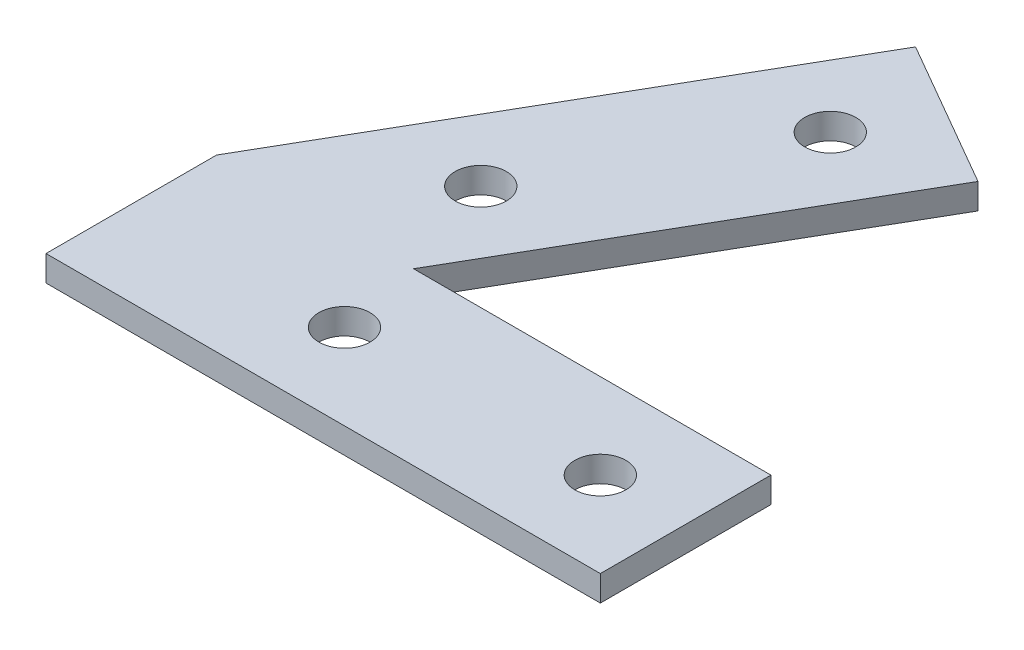
ISO-10303-21;
HEADER;
FILE_DESCRIPTION(('STEP AP214'),'2;1');
FILE_NAME('part.step','',(''),(''),'','','');
FILE_SCHEMA(('AUTOMOTIVE_DESIGN { 1 0 10303 214 1 1 1 1 }'));
ENDSEC;
DATA;
#1=APPLICATION_CONTEXT('core data for automotive mechanical design processes');
#2=APPLICATION_PROTOCOL_DEFINITION('international standard','automotive_design',2000,#1);
#3=PRODUCT_CONTEXT('',#1,'mechanical');
#4=PRODUCT('Part','Part','',(#3));
#5=PRODUCT_RELATED_PRODUCT_CATEGORY('part','',(#4));
#6=PRODUCT_DEFINITION_FORMATION('','',#4);
#7=PRODUCT_DEFINITION_CONTEXT('part definition',#1,'design');
#8=PRODUCT_DEFINITION('design','',#6,#7);
#9=PRODUCT_DEFINITION_SHAPE('','',#8);
#10=(LENGTH_UNIT() NAMED_UNIT(*) SI_UNIT(.MILLI.,.METRE.));
#11=(NAMED_UNIT(*) PLANE_ANGLE_UNIT() SI_UNIT($,.RADIAN.));
#12=(NAMED_UNIT(*) SI_UNIT($,.STERADIAN.) SOLID_ANGLE_UNIT());
#13=UNCERTAINTY_MEASURE_WITH_UNIT(LENGTH_MEASURE(1.E-05),#10,'distance_accuracy_value','');
#14=(GEOMETRIC_REPRESENTATION_CONTEXT(3) GLOBAL_UNCERTAINTY_ASSIGNED_CONTEXT((#13)) GLOBAL_UNIT_ASSIGNED_CONTEXT((#10,
#11,#12)) REPRESENTATION_CONTEXT('',''));
#15=CARTESIAN_POINT('',(0.,0.,0.));
#16=DIRECTION('',(0.,0.,1.));
#17=DIRECTION('',(1.,0.,0.));
#18=AXIS2_PLACEMENT_3D('',#15,#16,#17);
#19=CARTESIAN_POINT('',(38.6602540378446,3.,-66.9615242270662));
#20=DIRECTION('',(-0.500000000000003,0.,0.866025403784437));
#21=DIRECTION('',(0.866025403784437,0.,0.500000000000003));
#22=AXIS2_PLACEMENT_3D('',#19,#20,#21);
#23=PLANE('',#22);
#24=DIRECTION('',(-0.866025403784437,0.,-0.500000000000003));
#25=VECTOR('',#24,1.);
#26=CARTESIAN_POINT('',(38.6602540378446,0.,-66.9615242270662));
#27=LINE('',#26,#25);
#28=CARTESIAN_POINT('',(47.320508075689,0.,-61.9615242270661));
#29=VERTEX_POINT('',#28);
#30=CARTESIAN_POINT('',(30.0000000000002,0.,-71.9615242270662));
#31=VERTEX_POINT('',#30);
#32=EDGE_CURVE('E161',#29,#31,#27,.T.);
#33=ORIENTED_EDGE('',*,*,#32,.T.);
#34=DIRECTION('',(0.,-1.,0.));
#35=VECTOR('',#34,1.);
#36=CARTESIAN_POINT('',(30.0000000000002,3.,-71.9615242270662));
#37=LINE('',#36,#35);
#38=CARTESIAN_POINT('',(30.0000000000002,3.,-71.9615242270662));
#39=VERTEX_POINT('',#38);
#40=EDGE_CURVE('E11',#39,#31,#37,.T.);
#41=ORIENTED_EDGE('',*,*,#40,.F.);
#42=DIRECTION('',(-0.866025403784437,0.,-0.500000000000003));
#43=VECTOR('',#42,1.);
#44=CARTESIAN_POINT('',(38.6602540378446,3.,-66.9615242270662));
#45=LINE('',#44,#43);
#46=CARTESIAN_POINT('',(47.320508075689,3.,-61.9615242270661));
#47=VERTEX_POINT('',#46);
#48=EDGE_CURVE('E218',#47,#39,#45,.T.);
#49=ORIENTED_EDGE('',*,*,#48,.F.);
#50=DIRECTION('',(0.,-1.,0.));
#51=VECTOR('',#50,1.);
#52=CARTESIAN_POINT('',(47.320508075689,3.,-61.9615242270661));
#53=LINE('',#52,#51);
#54=EDGE_CURVE('E152',#47,#29,#53,.T.);
#55=ORIENTED_EDGE('',*,*,#54,.T.);
#56=EDGE_LOOP('',(#33,#41,#49,#55));
#57=FACE_BOUND('',#56,.T.);
#58=ADVANCED_FACE('F47',(#57),#23,.F.);
#59=CARTESIAN_POINT('',(-8.66025403784443,3.,-5.00000000000007));
#60=DIRECTION('',(0.866025403784436,0.,0.500000000000004));
#61=DIRECTION('',(0.500000000000004,0.,-0.866025403784437));
#62=AXIS2_PLACEMENT_3D('',#59,#60,#61);
#63=PLANE('',#62);
#64=DIRECTION('',(-0.500000000000004,0.,0.866025403784437));
#65=VECTOR('',#64,1.);
#66=CARTESIAN_POINT('',(-8.66025403784443,0.,-5.00000000000007));
#67=LINE('',#66,#65);
#68=CARTESIAN_POINT('',(0.,0.,-20.));
#69=VERTEX_POINT('',#68);
#70=EDGE_CURVE('E165',#31,#69,#67,.T.);
#71=ORIENTED_EDGE('',*,*,#70,.T.);
#72=DIRECTION('',(0.,-1.,0.));
#73=VECTOR('',#72,1.);
#74=CARTESIAN_POINT('',(0.,3.,-20.));
#75=LINE('',#74,#73);
#76=CARTESIAN_POINT('',(0.,3.,-20.));
#77=VERTEX_POINT('',#76);
#78=EDGE_CURVE('E57',#77,#69,#75,.T.);
#79=ORIENTED_EDGE('',*,*,#78,.F.);
#80=DIRECTION('',(-0.500000000000004,0.,0.866025403784437));
#81=VECTOR('',#80,1.);
#82=CARTESIAN_POINT('',(-8.66025403784443,3.,-5.00000000000007));
#83=LINE('',#82,#81);
#84=EDGE_CURVE('E105',#39,#77,#83,.T.);
#85=ORIENTED_EDGE('',*,*,#84,.F.);
#86=ORIENTED_EDGE('',*,*,#40,.T.);
#87=EDGE_LOOP('',(#71,#79,#85,#86));
#88=FACE_BOUND('',#87,.T.);
#89=ADVANCED_FACE('F205',(#88),#63,.F.);
#90=CARTESIAN_POINT('',(0.,3.,0.));
#91=DIRECTION('',(-1.,0.,0.));
#92=DIRECTION('',(0.,0.,1.));
#93=AXIS2_PLACEMENT_3D('',#90,#91,#92);
#94=PLANE('',#93);
#95=DIRECTION('',(0.,0.,-1.));
#96=VECTOR('',#95,1.);
#97=CARTESIAN_POINT('',(0.,0.,0.));
#98=LINE('',#97,#96);
#99=CARTESIAN_POINT('',(0.,0.,0.));
#100=VERTEX_POINT('',#99);
#101=EDGE_CURVE('E169',#100,#69,#98,.T.);
#102=ORIENTED_EDGE('',*,*,#101,.F.);
#103=DIRECTION('',(0.,-1.,0.));
#104=VECTOR('',#103,1.);
#105=CARTESIAN_POINT('',(0.,3.,0.));
#106=LINE('',#105,#104);
#107=CARTESIAN_POINT('',(0.,3.,0.));
#108=VERTEX_POINT('',#107);
#109=EDGE_CURVE('E197',#108,#100,#106,.T.);
#110=ORIENTED_EDGE('',*,*,#109,.F.);
#111=DIRECTION('',(0.,0.,-1.));
#112=VECTOR('',#111,1.);
#113=CARTESIAN_POINT('',(0.,3.,0.));
#114=LINE('',#113,#112);
#115=EDGE_CURVE('E204',#108,#77,#114,.T.);
#116=ORIENTED_EDGE('',*,*,#115,.T.);
#117=ORIENTED_EDGE('',*,*,#78,.T.);
#118=EDGE_LOOP('',(#102,#110,#116,#117));
#119=FACE_BOUND('',#118,.T.);
#120=ADVANCED_FACE('F203',(#119),#94,.T.);
#121=CARTESIAN_POINT('',(0.,3.,0.));
#122=DIRECTION('',(0.,0.,-1.));
#123=DIRECTION('',(-1.,0.,0.));
#124=AXIS2_PLACEMENT_3D('',#121,#122,#123);
#125=PLANE('',#124);
#126=DIRECTION('',(1.,0.,0.));
#127=VECTOR('',#126,1.);
#128=CARTESIAN_POINT('',(0.,0.,0.));
#129=LINE('',#128,#127);
#130=CARTESIAN_POINT('',(65.,0.,0.));
#131=VERTEX_POINT('',#130);
#132=EDGE_CURVE('E173',#100,#131,#129,.T.);
#133=ORIENTED_EDGE('',*,*,#132,.T.);
#134=DIRECTION('',(0.,-1.,0.));
#135=VECTOR('',#134,1.);
#136=CARTESIAN_POINT('',(65.,3.,0.));
#137=LINE('',#136,#135);
#138=CARTESIAN_POINT('',(65.,3.,0.));
#139=VERTEX_POINT('',#138);
#140=EDGE_CURVE('E134',#139,#131,#137,.T.);
#141=ORIENTED_EDGE('',*,*,#140,.F.);
#142=DIRECTION('',(1.,0.,0.));
#143=VECTOR('',#142,1.);
#144=CARTESIAN_POINT('',(0.,3.,0.));
#145=LINE('',#144,#143);
#146=EDGE_CURVE('E123',#108,#139,#145,.T.);
#147=ORIENTED_EDGE('',*,*,#146,.F.);
#148=ORIENTED_EDGE('',*,*,#109,.T.);
#149=EDGE_LOOP('',(#133,#141,#147,#148));
#150=FACE_BOUND('',#149,.T.);
#151=ADVANCED_FACE('F213',(#150),#125,.F.);
#152=CARTESIAN_POINT('',(65.,3.,0.));
#153=DIRECTION('',(-1.,0.,0.));
#154=DIRECTION('',(0.,0.,1.));
#155=AXIS2_PLACEMENT_3D('',#152,#153,#154);
#156=PLANE('',#155);
#157=DIRECTION('',(0.,0.,-1.));
#158=VECTOR('',#157,1.);
#159=CARTESIAN_POINT('',(65.,0.,0.));
#160=LINE('',#159,#158);
#161=CARTESIAN_POINT('',(65.,0.,-20.));
#162=VERTEX_POINT('',#161);
#163=EDGE_CURVE('E132',#131,#162,#160,.T.);
#164=ORIENTED_EDGE('',*,*,#163,.T.);
#165=DIRECTION('',(0.,-1.,0.));
#166=VECTOR('',#165,1.);
#167=CARTESIAN_POINT('',(65.,3.,-20.));
#168=LINE('',#167,#166);
#169=CARTESIAN_POINT('',(65.,3.,-20.));
#170=VERTEX_POINT('',#169);
#171=EDGE_CURVE('E129',#170,#162,#168,.T.);
#172=ORIENTED_EDGE('',*,*,#171,.F.);
#173=DIRECTION('',(0.,0.,-1.));
#174=VECTOR('',#173,1.);
#175=CARTESIAN_POINT('',(65.,3.,0.));
#176=LINE('',#175,#174);
#177=EDGE_CURVE('E115',#139,#170,#176,.T.);
#178=ORIENTED_EDGE('',*,*,#177,.F.);
#179=ORIENTED_EDGE('',*,*,#140,.T.);
#180=EDGE_LOOP('',(#164,#172,#178,#179));
#181=FACE_BOUND('',#180,.T.);
#182=ADVANCED_FACE('F130',(#181),#156,.F.);
#183=CARTESIAN_POINT('',(0.,3.,-20.));
#184=DIRECTION('',(0.,0.,1.));
#185=DIRECTION('',(1.,0.,0.));
#186=AXIS2_PLACEMENT_3D('',#183,#184,#185);
#187=PLANE('',#186);
#188=DIRECTION('',(-1.,0.,0.));
#189=VECTOR('',#188,1.);
#190=CARTESIAN_POINT('',(0.,0.,-20.));
#191=LINE('',#190,#189);
#192=CARTESIAN_POINT('',(23.094010767585,0.,-20.));
#193=VERTEX_POINT('',#192);
#194=EDGE_CURVE('E91',#162,#193,#191,.T.);
#195=ORIENTED_EDGE('',*,*,#194,.T.);
#196=DIRECTION('',(0.,-1.,0.));
#197=VECTOR('',#196,1.);
#198=CARTESIAN_POINT('',(23.094010767585,3.,-20.));
#199=LINE('',#198,#197);
#200=CARTESIAN_POINT('',(23.094010767585,3.,-20.));
#201=VERTEX_POINT('',#200);
#202=EDGE_CURVE('E135',#201,#193,#199,.T.);
#203=ORIENTED_EDGE('',*,*,#202,.F.);
#204=DIRECTION('',(-1.,0.,0.));
#205=VECTOR('',#204,1.);
#206=CARTESIAN_POINT('',(0.,3.,-20.));
#207=LINE('',#206,#205);
#208=EDGE_CURVE('E120',#170,#201,#207,.T.);
#209=ORIENTED_EDGE('',*,*,#208,.F.);
#210=ORIENTED_EDGE('',*,*,#171,.T.);
#211=EDGE_LOOP('',(#195,#203,#209,#210));
#212=FACE_BOUND('',#211,.T.);
#213=ADVANCED_FACE('F137',(#212),#187,.F.);
#214=CARTESIAN_POINT('',(18.6602540378482,3.,-32.3205080756865));
#215=DIRECTION('',(0.,-1.,0.));
#216=DIRECTION('',(0.,0.,-1.));
#217=AXIS2_PLACEMENT_3D('',#214,#215,#216);
#218=CYLINDRICAL_SURFACE('',#217,3.00000000000003);
#219=CARTESIAN_POINT('',(18.6602540378482,3.,-32.3205080756865));
#220=DIRECTION('',(0.,1.,0.));
#221=DIRECTION('',(0.,0.,1.));
#222=AXIS2_PLACEMENT_3D('',#219,#220,#221);
#223=CIRCLE('',#222,3.00000000000003);
#224=CARTESIAN_POINT('',(18.6602540378482,3.,-29.3205080756865));
#225=VERTEX_POINT('',#224);
#226=EDGE_CURVE('E141',#225,#225,#223,.T.);
#227=ORIENTED_EDGE('',*,*,#226,.T.);
#228=EDGE_LOOP('',(#227));
#229=FACE_BOUND('',#228,.T.);
#230=CARTESIAN_POINT('',(18.6602540378482,0.,-32.3205080756865));
#231=DIRECTION('',(0.,1.,0.));
#232=DIRECTION('',(0.,0.,1.));
#233=AXIS2_PLACEMENT_3D('',#230,#231,#232);
#234=CIRCLE('',#233,3.00000000000003);
#235=CARTESIAN_POINT('',(18.6602540378482,0.,-29.3205080756865));
#236=VERTEX_POINT('',#235);
#237=EDGE_CURVE('E182',#236,#236,#234,.T.);
#238=ORIENTED_EDGE('',*,*,#237,.F.);
#239=EDGE_LOOP('',(#238));
#240=FACE_BOUND('',#239,.T.);
#241=ADVANCED_FACE('F267',(#229,#240),#218,.F.);
#242=CARTESIAN_POINT('',(8.66025403784425,3.,4.99999999999998));
#243=DIRECTION('',(-0.866025403784436,0.,-0.500000000000004));
#244=DIRECTION('',(-0.500000000000004,0.,0.866025403784436));
#245=AXIS2_PLACEMENT_3D('',#242,#243,#244);
#246=PLANE('',#245);
#247=DIRECTION('',(0.500000000000004,0.,-0.866025403784436));
#248=VECTOR('',#247,1.);
#249=CARTESIAN_POINT('',(8.66025403784425,0.,4.99999999999998));
#250=LINE('',#249,#248);
#251=EDGE_CURVE('E97',#193,#29,#250,.T.);
#252=ORIENTED_EDGE('',*,*,#251,.T.);
#253=ORIENTED_EDGE('',*,*,#54,.F.);
#254=DIRECTION('',(0.500000000000004,0.,-0.866025403784436));
#255=VECTOR('',#254,1.);
#256=CARTESIAN_POINT('',(8.66025403784425,3.,4.99999999999998));
#257=LINE('',#256,#255);
#258=EDGE_CURVE('E65',#201,#47,#257,.T.);
#259=ORIENTED_EDGE('',*,*,#258,.F.);
#260=ORIENTED_EDGE('',*,*,#202,.T.);
#261=EDGE_LOOP('',(#252,#253,#259,#260));
#262=FACE_BOUND('',#261,.T.);
#263=ADVANCED_FACE('F242',(#262),#246,.F.);
#264=CARTESIAN_POINT('',(33.6602540378483,3.,-58.3012701892196));
#265=DIRECTION('',(0.,-1.,0.));
#266=DIRECTION('',(0.,0.,-1.));
#267=AXIS2_PLACEMENT_3D('',#264,#265,#266);
#268=CYLINDRICAL_SURFACE('',#267,3.);
#269=CARTESIAN_POINT('',(33.6602540378483,3.,-58.3012701892196));
#270=DIRECTION('',(0.,1.,0.));
#271=DIRECTION('',(0.,0.,1.));
#272=AXIS2_PLACEMENT_3D('',#269,#270,#271);
#273=CIRCLE('',#272,3.);
#274=CARTESIAN_POINT('',(33.6602540378483,3.,-55.3012701892196));
#275=VERTEX_POINT('',#274);
#276=EDGE_CURVE('E223',#275,#275,#273,.T.);
#277=ORIENTED_EDGE('',*,*,#276,.T.);
#278=EDGE_LOOP('',(#277));
#279=FACE_BOUND('',#278,.T.);
#280=CARTESIAN_POINT('',(33.6602540378483,0.,-58.3012701892196));
#281=DIRECTION('',(0.,1.,0.));
#282=DIRECTION('',(0.,0.,1.));
#283=AXIS2_PLACEMENT_3D('',#280,#281,#282);
#284=CIRCLE('',#283,3.);
#285=CARTESIAN_POINT('',(33.6602540378483,0.,-55.3012701892196));
#286=VERTEX_POINT('',#285);
#287=EDGE_CURVE('E157',#286,#286,#284,.T.);
#288=ORIENTED_EDGE('',*,*,#287,.F.);
#289=EDGE_LOOP('',(#288));
#290=FACE_BOUND('',#289,.T.);
#291=ADVANCED_FACE('F239',(#279,#290),#268,.F.);
#292=CARTESIAN_POINT('',(55.,3.,-10.));
#293=DIRECTION('',(0.,-1.,0.));
#294=DIRECTION('',(0.,0.,-1.));
#295=AXIS2_PLACEMENT_3D('',#292,#293,#294);
#296=CYLINDRICAL_SURFACE('',#295,3.);
#297=CARTESIAN_POINT('',(55.,3.,-10.));
#298=DIRECTION('',(0.,1.,0.));
#299=DIRECTION('',(0.,0.,1.));
#300=AXIS2_PLACEMENT_3D('',#297,#298,#299);
#301=CIRCLE('',#300,3.);
#302=CARTESIAN_POINT('',(55.,3.,-7.00000000000001));
#303=VERTEX_POINT('',#302);
#304=EDGE_CURVE('E190',#303,#303,#301,.T.);
#305=ORIENTED_EDGE('',*,*,#304,.T.);
#306=EDGE_LOOP('',(#305));
#307=FACE_BOUND('',#306,.T.);
#308=CARTESIAN_POINT('',(55.,0.,-10.));
#309=DIRECTION('',(0.,1.,0.));
#310=DIRECTION('',(0.,0.,1.));
#311=AXIS2_PLACEMENT_3D('',#308,#309,#310);
#312=CIRCLE('',#311,3.);
#313=CARTESIAN_POINT('',(55.,0.,-7.00000000000001));
#314=VERTEX_POINT('',#313);
#315=EDGE_CURVE('E153',#314,#314,#312,.T.);
#316=ORIENTED_EDGE('',*,*,#315,.F.);
#317=EDGE_LOOP('',(#316));
#318=FACE_BOUND('',#317,.T.);
#319=ADVANCED_FACE('F49',(#307,#318),#296,.F.);
#320=CARTESIAN_POINT('',(25.,3.,-10.));
#321=DIRECTION('',(0.,-1.,0.));
#322=DIRECTION('',(0.,0.,-1.));
#323=AXIS2_PLACEMENT_3D('',#320,#321,#322);
#324=CYLINDRICAL_SURFACE('',#323,3.);
#325=CARTESIAN_POINT('',(25.,3.,-10.));
#326=DIRECTION('',(0.,1.,0.));
#327=DIRECTION('',(0.,0.,1.));
#328=AXIS2_PLACEMENT_3D('',#325,#326,#327);
#329=CIRCLE('',#328,3.);
#330=CARTESIAN_POINT('',(25.,3.,-7.));
#331=VERTEX_POINT('',#330);
#332=EDGE_CURVE('E148',#331,#331,#329,.T.);
#333=ORIENTED_EDGE('',*,*,#332,.T.);
#334=EDGE_LOOP('',(#333));
#335=FACE_BOUND('',#334,.T.);
#336=CARTESIAN_POINT('',(25.,0.,-10.));
#337=DIRECTION('',(0.,1.,0.));
#338=DIRECTION('',(0.,0.,1.));
#339=AXIS2_PLACEMENT_3D('',#336,#337,#338);
#340=CIRCLE('',#339,3.);
#341=CARTESIAN_POINT('',(25.,0.,-7.));
#342=VERTEX_POINT('',#341);
#343=EDGE_CURVE('E186',#342,#342,#340,.T.);
#344=ORIENTED_EDGE('',*,*,#343,.F.);
#345=EDGE_LOOP('',(#344));
#346=FACE_BOUND('',#345,.T.);
#347=ADVANCED_FACE('F235',(#335,#346),#324,.F.);
#348=CARTESIAN_POINT('',(0.,3.,0.));
#349=DIRECTION('',(0.,1.,0.));
#350=DIRECTION('',(0.,0.,1.));
#351=AXIS2_PLACEMENT_3D('',#348,#349,#350);
#352=PLANE('',#351);
#353=ORIENTED_EDGE('',*,*,#304,.F.);
#354=EDGE_LOOP('',(#353));
#355=FACE_BOUND('',#354,.T.);
#356=ORIENTED_EDGE('',*,*,#276,.F.);
#357=EDGE_LOOP('',(#356));
#358=FACE_BOUND('',#357,.T.);
#359=ORIENTED_EDGE('',*,*,#48,.T.);
#360=ORIENTED_EDGE('',*,*,#84,.T.);
#361=ORIENTED_EDGE('',*,*,#115,.F.);
#362=ORIENTED_EDGE('',*,*,#146,.T.);
#363=ORIENTED_EDGE('',*,*,#177,.T.);
#364=ORIENTED_EDGE('',*,*,#208,.T.);
#365=ORIENTED_EDGE('',*,*,#258,.T.);
#366=EDGE_LOOP('',(#359,#360,#361,#362,#363,#364,#365));
#367=FACE_BOUND('',#366,.T.);
#368=ORIENTED_EDGE('',*,*,#226,.F.);
#369=EDGE_LOOP('',(#368));
#370=FACE_BOUND('',#369,.T.);
#371=ORIENTED_EDGE('',*,*,#332,.F.);
#372=EDGE_LOOP('',(#371));
#373=FACE_BOUND('',#372,.T.);
#374=ADVANCED_FACE('F117',(#355,#358,#367,#370,#373),#352,.T.);
#375=CARTESIAN_POINT('',(0.,0.,0.));
#376=DIRECTION('',(0.,1.,0.));
#377=DIRECTION('',(0.,0.,1.));
#378=AXIS2_PLACEMENT_3D('',#375,#376,#377);
#379=PLANE('',#378);
#380=ORIENTED_EDGE('',*,*,#315,.T.);
#381=EDGE_LOOP('',(#380));
#382=FACE_BOUND('',#381,.T.);
#383=ORIENTED_EDGE('',*,*,#287,.T.);
#384=EDGE_LOOP('',(#383));
#385=FACE_BOUND('',#384,.T.);
#386=ORIENTED_EDGE('',*,*,#32,.F.);
#387=ORIENTED_EDGE('',*,*,#251,.F.);
#388=ORIENTED_EDGE('',*,*,#194,.F.);
#389=ORIENTED_EDGE('',*,*,#163,.F.);
#390=ORIENTED_EDGE('',*,*,#132,.F.);
#391=ORIENTED_EDGE('',*,*,#101,.T.);
#392=ORIENTED_EDGE('',*,*,#70,.F.);
#393=EDGE_LOOP('',(#386,#387,#388,#389,#390,#391,#392));
#394=FACE_BOUND('',#393,.T.);
#395=ORIENTED_EDGE('',*,*,#237,.T.);
#396=EDGE_LOOP('',(#395));
#397=FACE_BOUND('',#396,.T.);
#398=ORIENTED_EDGE('',*,*,#343,.T.);
#399=EDGE_LOOP('',(#398));
#400=FACE_BOUND('',#399,.T.);
#401=ADVANCED_FACE('F210',(#382,#385,#394,#397,#400),#379,.F.);
#402=CLOSED_SHELL('',(#58,#89,#120,#151,#182,#213,#241,#263,#291,#319,#347,#374,#401));
#403=MANIFOLD_SOLID_BREP('B2',#402);
#404=ADVANCED_BREP_SHAPE_REPRESENTATION('',(#18,#403),#14);
#405=SHAPE_DEFINITION_REPRESENTATION(#9,#404);
ENDSEC;
END-ISO-10303-21;
